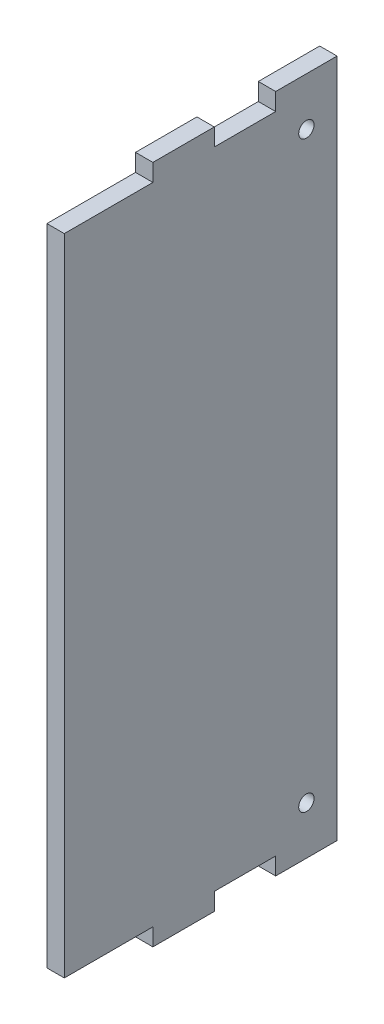
ISO-10303-21;
HEADER;
FILE_DESCRIPTION(('STEP AP214'),'2;1');
FILE_NAME('part.step','',(''),(''),'','','');
FILE_SCHEMA(('AUTOMOTIVE_DESIGN { 1 0 10303 214 1 1 1 1 }'));
ENDSEC;
DATA;
#1=APPLICATION_CONTEXT('core data for automotive mechanical design processes');
#2=APPLICATION_PROTOCOL_DEFINITION('international standard','automotive_design',2000,#1);
#3=PRODUCT_CONTEXT('',#1,'mechanical');
#4=PRODUCT('Part','Part','',(#3));
#5=PRODUCT_RELATED_PRODUCT_CATEGORY('part','',(#4));
#6=PRODUCT_DEFINITION_FORMATION('','',#4);
#7=PRODUCT_DEFINITION_CONTEXT('part definition',#1,'design');
#8=PRODUCT_DEFINITION('design','',#6,#7);
#9=PRODUCT_DEFINITION_SHAPE('','',#8);
#10=(LENGTH_UNIT() NAMED_UNIT(*) SI_UNIT(.MILLI.,.METRE.));
#11=(NAMED_UNIT(*) PLANE_ANGLE_UNIT() SI_UNIT($,.RADIAN.));
#12=(NAMED_UNIT(*) SI_UNIT($,.STERADIAN.) SOLID_ANGLE_UNIT());
#13=UNCERTAINTY_MEASURE_WITH_UNIT(LENGTH_MEASURE(1.E-05),#10,'distance_accuracy_value','');
#14=(GEOMETRIC_REPRESENTATION_CONTEXT(3) GLOBAL_UNCERTAINTY_ASSIGNED_CONTEXT((#13)) GLOBAL_UNIT_ASSIGNED_CONTEXT((#10,
#11,#12)) REPRESENTATION_CONTEXT('',''));
#15=CARTESIAN_POINT('',(0.,0.,0.));
#16=DIRECTION('',(0.,0.,1.));
#17=DIRECTION('',(1.,0.,0.));
#18=AXIS2_PLACEMENT_3D('',#15,#16,#17);
#19=CARTESIAN_POINT('',(94.0812678289956,18.4931544247679,88.8895949971045));
#20=DIRECTION('',(0.,0.,-1.));
#21=DIRECTION('',(-1.,0.,0.));
#22=AXIS2_PLACEMENT_3D('',#19,#20,#21);
#23=PLANE('',#22);
#24=DIRECTION('',(0.,-1.,0.));
#25=VECTOR('',#24,1.);
#26=CARTESIAN_POINT('',(91.2512678289956,18.4931544247679,88.8895949971045));
#27=LINE('',#26,#25);
#28=CARTESIAN_POINT('',(91.2512678289956,18.4931544247679,88.8895949971045));
#29=VERTEX_POINT('',#28);
#30=CARTESIAN_POINT('',(91.2512678289956,15.6631544247679,88.8895949971045));
#31=VERTEX_POINT('',#30);
#32=EDGE_CURVE('E178',#29,#31,#27,.T.);
#33=ORIENTED_EDGE('',*,*,#32,.T.);
#34=DIRECTION('',(-1.,0.,0.));
#35=VECTOR('',#34,1.);
#36=CARTESIAN_POINT('',(94.0812678289956,15.6631544247679,88.8895949971045));
#37=LINE('',#36,#35);
#38=CARTESIAN_POINT('',(94.0812678289956,15.6631544247679,88.8895949971045));
#39=VERTEX_POINT('',#38);
#40=EDGE_CURVE('E11',#39,#31,#37,.T.);
#41=ORIENTED_EDGE('',*,*,#40,.F.);
#42=DIRECTION('',(0.,-1.,0.));
#43=VECTOR('',#42,1.);
#44=CARTESIAN_POINT('',(94.0812678289956,18.4931544247679,88.8895949971045));
#45=LINE('',#44,#43);
#46=CARTESIAN_POINT('',(94.0812678289956,18.4931544247679,88.8895949971045));
#47=VERTEX_POINT('',#46);
#48=EDGE_CURVE('E209',#47,#39,#45,.T.);
#49=ORIENTED_EDGE('',*,*,#48,.F.);
#50=DIRECTION('',(-1.,0.,0.));
#51=VECTOR('',#50,1.);
#52=CARTESIAN_POINT('',(94.0812678289956,18.4931544247679,88.8895949971045));
#53=LINE('',#52,#51);
#54=EDGE_CURVE('E174',#47,#29,#53,.T.);
#55=ORIENTED_EDGE('',*,*,#54,.T.);
#56=EDGE_LOOP('',(#33,#41,#49,#55));
#57=FACE_BOUND('',#56,.T.);
#58=ADVANCED_FACE('F32',(#57),#23,.F.);
#59=CARTESIAN_POINT('',(94.0812678289956,15.6631544247679,88.8895949971045));
#60=DIRECTION('',(0.,1.,0.));
#61=DIRECTION('',(-1.,0.,0.));
#62=AXIS2_PLACEMENT_3D('',#59,#60,#61);
#63=PLANE('',#62);
#64=DIRECTION('',(0.,0.,-1.));
#65=VECTOR('',#64,1.);
#66=CARTESIAN_POINT('',(91.2512678289956,15.6631544247679,88.8895949971045));
#67=LINE('',#66,#65);
#68=CARTESIAN_POINT('',(91.2512678289956,15.6631544247679,78.8895949971045));
#69=VERTEX_POINT('',#68);
#70=EDGE_CURVE('E181',#31,#69,#67,.T.);
#71=ORIENTED_EDGE('',*,*,#70,.T.);
#72=DIRECTION('',(-1.,0.,0.));
#73=VECTOR('',#72,1.);
#74=CARTESIAN_POINT('',(94.0812678289956,15.6631544247679,78.8895949971045));
#75=LINE('',#74,#73);
#76=CARTESIAN_POINT('',(94.0812678289956,15.6631544247679,78.8895949971045));
#77=VERTEX_POINT('',#76);
#78=EDGE_CURVE('E41',#77,#69,#75,.T.);
#79=ORIENTED_EDGE('',*,*,#78,.F.);
#80=DIRECTION('',(0.,0.,-1.));
#81=VECTOR('',#80,1.);
#82=CARTESIAN_POINT('',(94.0812678289956,15.6631544247679,88.8895949971045));
#83=LINE('',#82,#81);
#84=EDGE_CURVE('E117',#39,#77,#83,.T.);
#85=ORIENTED_EDGE('',*,*,#84,.F.);
#86=ORIENTED_EDGE('',*,*,#40,.T.);
#87=EDGE_LOOP('',(#71,#79,#85,#86));
#88=FACE_BOUND('',#87,.T.);
#89=ADVANCED_FACE('F308',(#88),#63,.F.);
#90=CARTESIAN_POINT('',(94.0812678289956,15.6631544247679,78.8895949971045));
#91=DIRECTION('',(0.,0.,1.));
#92=DIRECTION('',(1.,0.,0.));
#93=AXIS2_PLACEMENT_3D('',#90,#91,#92);
#94=PLANE('',#93);
#95=DIRECTION('',(0.,1.,0.));
#96=VECTOR('',#95,1.);
#97=CARTESIAN_POINT('',(91.2512678289956,15.6631544247679,78.8895949971045));
#98=LINE('',#97,#96);
#99=CARTESIAN_POINT('',(91.2512678289956,18.4931544247679,78.8895949971045));
#100=VERTEX_POINT('',#99);
#101=EDGE_CURVE('E183',#69,#100,#98,.T.);
#102=ORIENTED_EDGE('',*,*,#101,.T.);
#103=DIRECTION('',(-1.,0.,0.));
#104=VECTOR('',#103,1.);
#105=CARTESIAN_POINT('',(94.0812678289956,18.4931544247679,78.8895949971045));
#106=LINE('',#105,#104);
#107=CARTESIAN_POINT('',(94.0812678289956,18.4931544247679,78.8895949971045));
#108=VERTEX_POINT('',#107);
#109=EDGE_CURVE('E240',#108,#100,#106,.T.);
#110=ORIENTED_EDGE('',*,*,#109,.F.);
#111=DIRECTION('',(0.,1.,0.));
#112=VECTOR('',#111,1.);
#113=CARTESIAN_POINT('',(94.0812678289956,15.6631544247679,78.8895949971045));
#114=LINE('',#113,#112);
#115=EDGE_CURVE('E260',#77,#108,#114,.T.);
#116=ORIENTED_EDGE('',*,*,#115,.F.);
#117=ORIENTED_EDGE('',*,*,#78,.T.);
#118=EDGE_LOOP('',(#102,#110,#116,#117));
#119=FACE_BOUND('',#118,.T.);
#120=ADVANCED_FACE('F312',(#119),#94,.F.);
#121=CARTESIAN_POINT('',(94.0812678289956,18.4931544247679,78.8895949971045));
#122=DIRECTION('',(0.,1.,0.));
#123=DIRECTION('',(-1.,0.,0.));
#124=AXIS2_PLACEMENT_3D('',#121,#122,#123);
#125=PLANE('',#124);
#126=DIRECTION('',(0.,0.,-1.));
#127=VECTOR('',#126,1.);
#128=CARTESIAN_POINT('',(91.2512678289956,18.4931544247679,78.8895949971045));
#129=LINE('',#128,#127);
#130=CARTESIAN_POINT('',(91.2512678289956,18.4931544247679,68.8895949971045));
#131=VERTEX_POINT('',#130);
#132=EDGE_CURVE('E185',#100,#131,#129,.T.);
#133=ORIENTED_EDGE('',*,*,#132,.T.);
#134=DIRECTION('',(-1.,0.,0.));
#135=VECTOR('',#134,1.);
#136=CARTESIAN_POINT('',(94.0812678289956,18.4931544247679,68.8895949971045));
#137=LINE('',#136,#135);
#138=CARTESIAN_POINT('',(94.0812678289956,18.4931544247679,68.8895949971045));
#139=VERTEX_POINT('',#138);
#140=EDGE_CURVE('E237',#139,#131,#137,.T.);
#141=ORIENTED_EDGE('',*,*,#140,.F.);
#142=DIRECTION('',(0.,0.,-1.));
#143=VECTOR('',#142,1.);
#144=CARTESIAN_POINT('',(94.0812678289956,18.4931544247679,78.8895949971045));
#145=LINE('',#144,#143);
#146=EDGE_CURVE('E262',#108,#139,#145,.T.);
#147=ORIENTED_EDGE('',*,*,#146,.F.);
#148=ORIENTED_EDGE('',*,*,#109,.T.);
#149=EDGE_LOOP('',(#133,#141,#147,#148));
#150=FACE_BOUND('',#149,.T.);
#151=ADVANCED_FACE('F316',(#150),#125,.F.);
#152=CARTESIAN_POINT('',(94.0812678289956,18.4931544247679,68.8895949971045));
#153=DIRECTION('',(0.,0.,-1.));
#154=DIRECTION('',(-1.,0.,0.));
#155=AXIS2_PLACEMENT_3D('',#152,#153,#154);
#156=PLANE('',#155);
#157=DIRECTION('',(0.,-1.,0.));
#158=VECTOR('',#157,1.);
#159=CARTESIAN_POINT('',(91.2512678289956,18.4931544247679,68.8895949971045));
#160=LINE('',#159,#158);
#161=CARTESIAN_POINT('',(91.2512678289956,15.6631544247679,68.8895949971045));
#162=VERTEX_POINT('',#161);
#163=EDGE_CURVE('E187',#131,#162,#160,.T.);
#164=ORIENTED_EDGE('',*,*,#163,.T.);
#165=DIRECTION('',(-1.,0.,0.));
#166=VECTOR('',#165,1.);
#167=CARTESIAN_POINT('',(94.0812678289956,15.6631544247679,68.8895949971045));
#168=LINE('',#167,#166);
#169=CARTESIAN_POINT('',(94.0812678289956,15.6631544247679,68.8895949971045));
#170=VERTEX_POINT('',#169);
#171=EDGE_CURVE('E234',#170,#162,#168,.T.);
#172=ORIENTED_EDGE('',*,*,#171,.F.);
#173=DIRECTION('',(0.,-1.,0.));
#174=VECTOR('',#173,1.);
#175=CARTESIAN_POINT('',(94.0812678289956,18.4931544247679,68.8895949971045));
#176=LINE('',#175,#174);
#177=EDGE_CURVE('E264',#139,#170,#176,.T.);
#178=ORIENTED_EDGE('',*,*,#177,.F.);
#179=ORIENTED_EDGE('',*,*,#140,.T.);
#180=EDGE_LOOP('',(#164,#172,#178,#179));
#181=FACE_BOUND('',#180,.T.);
#182=ADVANCED_FACE('F322',(#181),#156,.F.);
#183=CARTESIAN_POINT('',(94.0812678289956,15.6631544247679,68.8895949971045));
#184=DIRECTION('',(0.,1.,0.));
#185=DIRECTION('',(-1.,0.,0.));
#186=AXIS2_PLACEMENT_3D('',#183,#184,#185);
#187=PLANE('',#186);
#188=DIRECTION('',(0.,0.,-1.));
#189=VECTOR('',#188,1.);
#190=CARTESIAN_POINT('',(91.2512678289956,15.6631544247679,68.8895949971045));
#191=LINE('',#190,#189);
#192=CARTESIAN_POINT('',(91.2512678289956,15.6631544247679,58.8895949971045));
#193=VERTEX_POINT('',#192);
#194=EDGE_CURVE('E189',#162,#193,#191,.T.);
#195=ORIENTED_EDGE('',*,*,#194,.T.);
#196=DIRECTION('',(-1.,0.,0.));
#197=VECTOR('',#196,1.);
#198=CARTESIAN_POINT('',(94.0812678289956,15.6631544247679,58.8895949971045));
#199=LINE('',#198,#197);
#200=CARTESIAN_POINT('',(94.0812678289956,15.6631544247679,58.8895949971045));
#201=VERTEX_POINT('',#200);
#202=EDGE_CURVE('E231',#201,#193,#199,.T.);
#203=ORIENTED_EDGE('',*,*,#202,.F.);
#204=DIRECTION('',(0.,0.,-1.));
#205=VECTOR('',#204,1.);
#206=CARTESIAN_POINT('',(94.0812678289956,15.6631544247679,68.8895949971045));
#207=LINE('',#206,#205);
#208=EDGE_CURVE('E266',#170,#201,#207,.T.);
#209=ORIENTED_EDGE('',*,*,#208,.F.);
#210=ORIENTED_EDGE('',*,*,#171,.T.);
#211=EDGE_LOOP('',(#195,#203,#209,#210));
#212=FACE_BOUND('',#211,.T.);
#213=ADVANCED_FACE('F326',(#212),#187,.F.);
#214=CARTESIAN_POINT('',(94.0812678289955,123.493154424767,58.8895949971045));
#215=DIRECTION('',(0.,0.,1.));
#216=DIRECTION('',(1.,0.,0.));
#217=AXIS2_PLACEMENT_3D('',#214,#215,#216);
#218=PLANE('',#217);
#219=DIRECTION('',(0.,1.,0.));
#220=VECTOR('',#219,1.);
#221=CARTESIAN_POINT('',(91.2512678289955,123.493154424767,58.8895949971045));
#222=LINE('',#221,#220);
#223=CARTESIAN_POINT('',(91.2512678289955,126.323154424767,58.8895949971045));
#224=VERTEX_POINT('',#223);
#225=EDGE_CURVE('E192',#193,#224,#222,.T.);
#226=ORIENTED_EDGE('',*,*,#225,.T.);
#227=DIRECTION('',(-1.,0.,0.));
#228=VECTOR('',#227,1.);
#229=CARTESIAN_POINT('',(94.0812678289955,126.323154424767,58.8895949971045));
#230=LINE('',#229,#228);
#231=CARTESIAN_POINT('',(94.0812678289955,126.323154424767,58.8895949971045));
#232=VERTEX_POINT('',#231);
#233=EDGE_CURVE('E228',#232,#224,#230,.T.);
#234=ORIENTED_EDGE('',*,*,#233,.F.);
#235=DIRECTION('',(0.,1.,0.));
#236=VECTOR('',#235,1.);
#237=CARTESIAN_POINT('',(94.0812678289956,15.6631544247679,58.8895949971045));
#238=LINE('',#237,#236);
#239=EDGE_CURVE('E268',#201,#232,#238,.T.);
#240=ORIENTED_EDGE('',*,*,#239,.F.);
#241=ORIENTED_EDGE('',*,*,#202,.T.);
#242=EDGE_LOOP('',(#226,#234,#240,#241));
#243=FACE_BOUND('',#242,.T.);
#244=ADVANCED_FACE('F330',(#243),#218,.F.);
#245=CARTESIAN_POINT('',(94.0812678289955,126.323154424767,58.8895949971045));
#246=DIRECTION('',(0.,-1.,0.));
#247=DIRECTION('',(1.,0.,0.));
#248=AXIS2_PLACEMENT_3D('',#245,#246,#247);
#249=PLANE('',#248);
#250=DIRECTION('',(0.,0.,1.));
#251=VECTOR('',#250,1.);
#252=CARTESIAN_POINT('',(91.2512678289955,126.323154424767,58.8895949971045));
#253=LINE('',#252,#251);
#254=CARTESIAN_POINT('',(91.2512678289955,126.323154424767,68.8895949971045));
#255=VERTEX_POINT('',#254);
#256=EDGE_CURVE('E194',#224,#255,#253,.T.);
#257=ORIENTED_EDGE('',*,*,#256,.T.);
#258=DIRECTION('',(-1.,0.,0.));
#259=VECTOR('',#258,1.);
#260=CARTESIAN_POINT('',(94.0812678289955,126.323154424767,68.8895949971045));
#261=LINE('',#260,#259);
#262=CARTESIAN_POINT('',(94.0812678289955,126.323154424767,68.8895949971045));
#263=VERTEX_POINT('',#262);
#264=EDGE_CURVE('E225',#263,#255,#261,.T.);
#265=ORIENTED_EDGE('',*,*,#264,.F.);
#266=DIRECTION('',(0.,0.,1.));
#267=VECTOR('',#266,1.);
#268=CARTESIAN_POINT('',(94.0812678289955,126.323154424767,58.8895949971045));
#269=LINE('',#268,#267);
#270=EDGE_CURVE('E270',#232,#263,#269,.T.);
#271=ORIENTED_EDGE('',*,*,#270,.F.);
#272=ORIENTED_EDGE('',*,*,#233,.T.);
#273=EDGE_LOOP('',(#257,#265,#271,#272));
#274=FACE_BOUND('',#273,.T.);
#275=ADVANCED_FACE('F334',(#274),#249,.F.);
#276=CARTESIAN_POINT('',(94.0812678289955,126.323154424767,68.8895949971045));
#277=DIRECTION('',(0.,0.,-1.));
#278=DIRECTION('',(-1.,0.,0.));
#279=AXIS2_PLACEMENT_3D('',#276,#277,#278);
#280=PLANE('',#279);
#281=DIRECTION('',(0.,-1.,0.));
#282=VECTOR('',#281,1.);
#283=CARTESIAN_POINT('',(91.2512678289955,126.323154424767,68.8895949971045));
#284=LINE('',#283,#282);
#285=CARTESIAN_POINT('',(91.2512678289955,123.493154424767,68.8895949971045));
#286=VERTEX_POINT('',#285);
#287=EDGE_CURVE('E196',#255,#286,#284,.T.);
#288=ORIENTED_EDGE('',*,*,#287,.T.);
#289=DIRECTION('',(-1.,0.,0.));
#290=VECTOR('',#289,1.);
#291=CARTESIAN_POINT('',(94.0812678289955,123.493154424767,68.8895949971045));
#292=LINE('',#291,#290);
#293=CARTESIAN_POINT('',(94.0812678289955,123.493154424767,68.8895949971045));
#294=VERTEX_POINT('',#293);
#295=EDGE_CURVE('E222',#294,#286,#292,.T.);
#296=ORIENTED_EDGE('',*,*,#295,.F.);
#297=DIRECTION('',(0.,-1.,0.));
#298=VECTOR('',#297,1.);
#299=CARTESIAN_POINT('',(94.0812678289955,126.323154424767,68.8895949971045));
#300=LINE('',#299,#298);
#301=EDGE_CURVE('E272',#263,#294,#300,.T.);
#302=ORIENTED_EDGE('',*,*,#301,.F.);
#303=ORIENTED_EDGE('',*,*,#264,.T.);
#304=EDGE_LOOP('',(#288,#296,#302,#303));
#305=FACE_BOUND('',#304,.T.);
#306=ADVANCED_FACE('F338',(#305),#280,.F.);
#307=CARTESIAN_POINT('',(94.0812678289955,123.493154424767,78.8895949971045));
#308=DIRECTION('',(0.,-1.,0.));
#309=DIRECTION('',(1.,0.,0.));
#310=AXIS2_PLACEMENT_3D('',#307,#308,#309);
#311=PLANE('',#310);
#312=DIRECTION('',(0.,0.,1.));
#313=VECTOR('',#312,1.);
#314=CARTESIAN_POINT('',(91.2512678289955,123.493154424767,78.8895949971045));
#315=LINE('',#314,#313);
#316=CARTESIAN_POINT('',(91.2512678289955,123.493154424767,78.8895949971045));
#317=VERTEX_POINT('',#316);
#318=EDGE_CURVE('E198',#286,#317,#315,.T.);
#319=ORIENTED_EDGE('',*,*,#318,.T.);
#320=DIRECTION('',(-1.,0.,0.));
#321=VECTOR('',#320,1.);
#322=CARTESIAN_POINT('',(94.0812678289955,123.493154424767,78.8895949971045));
#323=LINE('',#322,#321);
#324=CARTESIAN_POINT('',(94.0812678289955,123.493154424767,78.8895949971045));
#325=VERTEX_POINT('',#324);
#326=EDGE_CURVE('E219',#325,#317,#323,.T.);
#327=ORIENTED_EDGE('',*,*,#326,.F.);
#328=DIRECTION('',(0.,0.,1.));
#329=VECTOR('',#328,1.);
#330=CARTESIAN_POINT('',(94.0812678289955,123.493154424767,78.8895949971045));
#331=LINE('',#330,#329);
#332=EDGE_CURVE('E274',#294,#325,#331,.T.);
#333=ORIENTED_EDGE('',*,*,#332,.F.);
#334=ORIENTED_EDGE('',*,*,#295,.T.);
#335=EDGE_LOOP('',(#319,#327,#333,#334));
#336=FACE_BOUND('',#335,.T.);
#337=ADVANCED_FACE('F342',(#336),#311,.F.);
#338=CARTESIAN_POINT('',(94.0812678289955,123.493154424767,78.8895949971045));
#339=DIRECTION('',(0.,0.,1.));
#340=DIRECTION('',(1.,0.,0.));
#341=AXIS2_PLACEMENT_3D('',#338,#339,#340);
#342=PLANE('',#341);
#343=DIRECTION('',(0.,1.,0.));
#344=VECTOR('',#343,1.);
#345=CARTESIAN_POINT('',(91.2512678289955,123.493154424767,78.8895949971045));
#346=LINE('',#345,#344);
#347=CARTESIAN_POINT('',(91.2512678289955,126.323154424767,78.8895949971045));
#348=VERTEX_POINT('',#347);
#349=EDGE_CURVE('E200',#317,#348,#346,.T.);
#350=ORIENTED_EDGE('',*,*,#349,.T.);
#351=DIRECTION('',(-1.,0.,0.));
#352=VECTOR('',#351,1.);
#353=CARTESIAN_POINT('',(94.0812678289955,126.323154424767,78.8895949971045));
#354=LINE('',#353,#352);
#355=CARTESIAN_POINT('',(94.0812678289955,126.323154424767,78.8895949971045));
#356=VERTEX_POINT('',#355);
#357=EDGE_CURVE('E216',#356,#348,#354,.T.);
#358=ORIENTED_EDGE('',*,*,#357,.F.);
#359=DIRECTION('',(0.,1.,0.));
#360=VECTOR('',#359,1.);
#361=CARTESIAN_POINT('',(94.0812678289955,123.493154424767,78.8895949971045));
#362=LINE('',#361,#360);
#363=EDGE_CURVE('E276',#325,#356,#362,.T.);
#364=ORIENTED_EDGE('',*,*,#363,.F.);
#365=ORIENTED_EDGE('',*,*,#326,.T.);
#366=EDGE_LOOP('',(#350,#358,#364,#365));
#367=FACE_BOUND('',#366,.T.);
#368=ADVANCED_FACE('F346',(#367),#342,.F.);
#369=CARTESIAN_POINT('',(94.0812678289955,126.323154424767,78.8895949971045));
#370=DIRECTION('',(0.,-1.,0.));
#371=DIRECTION('',(1.,0.,0.));
#372=AXIS2_PLACEMENT_3D('',#369,#370,#371);
#373=PLANE('',#372);
#374=DIRECTION('',(0.,0.,1.));
#375=VECTOR('',#374,1.);
#376=CARTESIAN_POINT('',(91.2512678289955,126.323154424767,78.8895949971045));
#377=LINE('',#376,#375);
#378=CARTESIAN_POINT('',(91.2512678289955,126.323154424767,88.8895949971045));
#379=VERTEX_POINT('',#378);
#380=EDGE_CURVE('E202',#348,#379,#377,.T.);
#381=ORIENTED_EDGE('',*,*,#380,.T.);
#382=DIRECTION('',(-1.,0.,0.));
#383=VECTOR('',#382,1.);
#384=CARTESIAN_POINT('',(94.0812678289955,126.323154424767,88.8895949971045));
#385=LINE('',#384,#383);
#386=CARTESIAN_POINT('',(94.0812678289955,126.323154424767,88.8895949971045));
#387=VERTEX_POINT('',#386);
#388=EDGE_CURVE('E213',#387,#379,#385,.T.);
#389=ORIENTED_EDGE('',*,*,#388,.F.);
#390=DIRECTION('',(0.,0.,1.));
#391=VECTOR('',#390,1.);
#392=CARTESIAN_POINT('',(94.0812678289955,126.323154424767,78.8895949971045));
#393=LINE('',#392,#391);
#394=EDGE_CURVE('E278',#356,#387,#393,.T.);
#395=ORIENTED_EDGE('',*,*,#394,.F.);
#396=ORIENTED_EDGE('',*,*,#357,.T.);
#397=EDGE_LOOP('',(#381,#389,#395,#396));
#398=FACE_BOUND('',#397,.T.);
#399=ADVANCED_FACE('F284',(#398),#373,.F.);
#400=CARTESIAN_POINT('',(94.0812678289955,126.323154424767,88.8895949971045));
#401=DIRECTION('',(0.,0.,-1.));
#402=DIRECTION('',(-1.,0.,0.));
#403=AXIS2_PLACEMENT_3D('',#400,#401,#402);
#404=PLANE('',#403);
#405=DIRECTION('',(0.,-1.,0.));
#406=VECTOR('',#405,1.);
#407=CARTESIAN_POINT('',(91.2512678289955,126.323154424767,88.8895949971045));
#408=LINE('',#407,#406);
#409=CARTESIAN_POINT('',(91.2512678289955,123.493154424767,88.8895949971045));
#410=VERTEX_POINT('',#409);
#411=EDGE_CURVE('E204',#379,#410,#408,.T.);
#412=ORIENTED_EDGE('',*,*,#411,.T.);
#413=DIRECTION('',(-1.,0.,0.));
#414=VECTOR('',#413,1.);
#415=CARTESIAN_POINT('',(94.0812678289955,123.493154424767,88.8895949971045));
#416=LINE('',#415,#414);
#417=CARTESIAN_POINT('',(94.0812678289955,123.493154424767,88.8895949971045));
#418=VERTEX_POINT('',#417);
#419=EDGE_CURVE('E169',#418,#410,#416,.T.);
#420=ORIENTED_EDGE('',*,*,#419,.F.);
#421=DIRECTION('',(0.,-1.,0.));
#422=VECTOR('',#421,1.);
#423=CARTESIAN_POINT('',(94.0812678289955,126.323154424767,88.8895949971045));
#424=LINE('',#423,#422);
#425=EDGE_CURVE('E160',#387,#418,#424,.T.);
#426=ORIENTED_EDGE('',*,*,#425,.F.);
#427=ORIENTED_EDGE('',*,*,#388,.T.);
#428=EDGE_LOOP('',(#412,#420,#426,#427));
#429=FACE_BOUND('',#428,.T.);
#430=ADVANCED_FACE('F288',(#429),#404,.F.);
#431=CARTESIAN_POINT('',(94.0812678289955,123.493154424767,103.31959093539));
#432=DIRECTION('',(0.,-1.,0.));
#433=DIRECTION('',(0.,0.,-1.));
#434=AXIS2_PLACEMENT_3D('',#431,#432,#433);
#435=PLANE('',#434);
#436=DIRECTION('',(0.,0.,1.));
#437=VECTOR('',#436,1.);
#438=CARTESIAN_POINT('',(91.2512678289955,123.493154424767,103.31959093539));
#439=LINE('',#438,#437);
#440=CARTESIAN_POINT('',(91.2512678289955,123.493154424767,103.31959093539));
#441=VERTEX_POINT('',#440);
#442=EDGE_CURVE('E168',#410,#441,#439,.T.);
#443=ORIENTED_EDGE('',*,*,#442,.T.);
#444=DIRECTION('',(-1.,0.,0.));
#445=VECTOR('',#444,1.);
#446=CARTESIAN_POINT('',(94.0812678289955,123.493154424767,103.31959093539));
#447=LINE('',#446,#445);
#448=CARTESIAN_POINT('',(94.0812678289955,123.493154424767,103.31959093539));
#449=VERTEX_POINT('',#448);
#450=EDGE_CURVE('E165',#449,#441,#447,.T.);
#451=ORIENTED_EDGE('',*,*,#450,.F.);
#452=DIRECTION('',(0.,0.,1.));
#453=VECTOR('',#452,1.);
#454=CARTESIAN_POINT('',(94.0812678289955,123.493154424767,103.31959093539));
#455=LINE('',#454,#453);
#456=EDGE_CURVE('E154',#418,#449,#455,.T.);
#457=ORIENTED_EDGE('',*,*,#456,.F.);
#458=ORIENTED_EDGE('',*,*,#419,.T.);
#459=EDGE_LOOP('',(#443,#451,#457,#458));
#460=FACE_BOUND('',#459,.T.);
#461=ADVANCED_FACE('F166',(#460),#435,.F.);
#462=CARTESIAN_POINT('',(94.0812678289955,18.4931544247679,103.31959093539));
#463=DIRECTION('',(0.,0.,-1.));
#464=DIRECTION('',(-1.,0.,0.));
#465=AXIS2_PLACEMENT_3D('',#462,#463,#464);
#466=PLANE('',#465);
#467=DIRECTION('',(0.,-1.,0.));
#468=VECTOR('',#467,1.);
#469=CARTESIAN_POINT('',(91.2512678289956,18.4931544247679,103.31959093539));
#470=LINE('',#469,#468);
#471=CARTESIAN_POINT('',(91.2512678289956,18.4931544247679,103.31959093539));
#472=VERTEX_POINT('',#471);
#473=EDGE_CURVE('E103',#441,#472,#470,.T.);
#474=ORIENTED_EDGE('',*,*,#473,.T.);
#475=DIRECTION('',(-1.,0.,0.));
#476=VECTOR('',#475,1.);
#477=CARTESIAN_POINT('',(94.0812678289955,18.4931544247679,103.31959093539));
#478=LINE('',#477,#476);
#479=CARTESIAN_POINT('',(94.0812678289955,18.4931544247679,103.31959093539));
#480=VERTEX_POINT('',#479);
#481=EDGE_CURVE('E170',#480,#472,#478,.T.);
#482=ORIENTED_EDGE('',*,*,#481,.F.);
#483=DIRECTION('',(0.,-1.,0.));
#484=VECTOR('',#483,1.);
#485=CARTESIAN_POINT('',(94.0812678289955,18.4931544247679,103.31959093539));
#486=LINE('',#485,#484);
#487=EDGE_CURVE('E158',#449,#480,#486,.T.);
#488=ORIENTED_EDGE('',*,*,#487,.F.);
#489=ORIENTED_EDGE('',*,*,#450,.T.);
#490=EDGE_LOOP('',(#474,#482,#488,#489));
#491=FACE_BOUND('',#490,.T.);
#492=ADVANCED_FACE('F172',(#491),#466,.F.);
#493=CARTESIAN_POINT('',(94.0812678289956,18.4931544247679,88.8895949971045));
#494=DIRECTION('',(0.,1.,0.));
#495=DIRECTION('',(-1.,0.,0.));
#496=AXIS2_PLACEMENT_3D('',#493,#494,#495);
#497=PLANE('',#496);
#498=DIRECTION('',(0.,0.,-1.));
#499=VECTOR('',#498,1.);
#500=CARTESIAN_POINT('',(91.2512678289956,18.4931544247679,88.8895949971045));
#501=LINE('',#500,#499);
#502=EDGE_CURVE('E109',#472,#29,#501,.T.);
#503=ORIENTED_EDGE('',*,*,#502,.T.);
#504=ORIENTED_EDGE('',*,*,#54,.F.);
#505=DIRECTION('',(0.,0.,-1.));
#506=VECTOR('',#505,1.);
#507=CARTESIAN_POINT('',(94.0812678289956,18.4931544247679,88.8895949971045));
#508=LINE('',#507,#506);
#509=EDGE_CURVE('E50',#480,#47,#508,.T.);
#510=ORIENTED_EDGE('',*,*,#509,.F.);
#511=ORIENTED_EDGE('',*,*,#481,.T.);
#512=EDGE_LOOP('',(#503,#504,#510,#511));
#513=FACE_BOUND('',#512,.T.);
#514=ADVANCED_FACE('F296',(#513),#497,.F.);
#515=CARTESIAN_POINT('',(94.0812678289957,0.,1.30563987162096E-13));
#516=DIRECTION('',(1.,0.,0.));
#517=DIRECTION('',(0.,0.,-1.));
#518=AXIS2_PLACEMENT_3D('',#515,#516,#517);
#519=PLANE('',#518);
#520=CARTESIAN_POINT('',(94.0812678289956,23.4931544247679,63.8895949971045));
#521=DIRECTION('',(1.,0.,0.));
#522=DIRECTION('',(0.,0.,-1.));
#523=AXIS2_PLACEMENT_3D('',#520,#521,#522);
#524=CIRCLE('',#523,1.25);
#525=CARTESIAN_POINT('',(94.0812678289956,23.4931544247679,62.6395949971045));
#526=VERTEX_POINT('',#525);
#527=EDGE_CURVE('E246',#526,#526,#524,.T.);
#528=ORIENTED_EDGE('',*,*,#527,.F.);
#529=EDGE_LOOP('',(#528));
#530=FACE_BOUND('',#529,.T.);
#531=CARTESIAN_POINT('',(94.0812678289956,118.493154424767,63.8895949971045));
#532=DIRECTION('',(1.,0.,0.));
#533=DIRECTION('',(0.,0.,-1.));
#534=AXIS2_PLACEMENT_3D('',#531,#532,#533);
#535=CIRCLE('',#534,1.25);
#536=CARTESIAN_POINT('',(94.0812678289956,118.493154424767,62.6395949971045));
#537=VERTEX_POINT('',#536);
#538=EDGE_CURVE('E251',#537,#537,#535,.T.);
#539=ORIENTED_EDGE('',*,*,#538,.F.);
#540=EDGE_LOOP('',(#539));
#541=FACE_BOUND('',#540,.T.);
#542=ORIENTED_EDGE('',*,*,#48,.T.);
#543=ORIENTED_EDGE('',*,*,#84,.T.);
#544=ORIENTED_EDGE('',*,*,#115,.T.);
#545=ORIENTED_EDGE('',*,*,#146,.T.);
#546=ORIENTED_EDGE('',*,*,#177,.T.);
#547=ORIENTED_EDGE('',*,*,#208,.T.);
#548=ORIENTED_EDGE('',*,*,#239,.T.);
#549=ORIENTED_EDGE('',*,*,#270,.T.);
#550=ORIENTED_EDGE('',*,*,#301,.T.);
#551=ORIENTED_EDGE('',*,*,#332,.T.);
#552=ORIENTED_EDGE('',*,*,#363,.T.);
#553=ORIENTED_EDGE('',*,*,#394,.T.);
#554=ORIENTED_EDGE('',*,*,#425,.T.);
#555=ORIENTED_EDGE('',*,*,#456,.T.);
#556=ORIENTED_EDGE('',*,*,#487,.T.);
#557=ORIENTED_EDGE('',*,*,#509,.T.);
#558=EDGE_LOOP('',(#542,#543,#544,#545,#546,#547,#548,#549,#550,#551,#552,#553,#554,#555,#556,#557));
#559=FACE_BOUND('',#558,.T.);
#560=ADVANCED_FACE('F156',(#530,#541,#559),#519,.T.);
#561=CARTESIAN_POINT('',(91.2512678289957,0.,1.26636573212485E-13));
#562=DIRECTION('',(1.,0.,0.));
#563=DIRECTION('',(0.,0.,-1.));
#564=AXIS2_PLACEMENT_3D('',#561,#562,#563);
#565=PLANE('',#564);
#566=CARTESIAN_POINT('',(91.2512678289956,23.4931544247679,63.8895949971045));
#567=DIRECTION('',(1.,0.,0.));
#568=DIRECTION('',(0.,0.,-1.));
#569=AXIS2_PLACEMENT_3D('',#566,#567,#568);
#570=CIRCLE('',#569,1.25);
#571=CARTESIAN_POINT('',(91.2512678289956,23.4931544247679,62.6395949971045));
#572=VERTEX_POINT('',#571);
#573=EDGE_CURVE('E35',#572,#572,#570,.T.);
#574=ORIENTED_EDGE('',*,*,#573,.T.);
#575=EDGE_LOOP('',(#574));
#576=FACE_BOUND('',#575,.T.);
#577=CARTESIAN_POINT('',(91.2512678289956,118.493154424767,63.8895949971045));
#578=DIRECTION('',(1.,0.,0.));
#579=DIRECTION('',(0.,0.,-1.));
#580=AXIS2_PLACEMENT_3D('',#577,#578,#579);
#581=CIRCLE('',#580,1.25);
#582=CARTESIAN_POINT('',(91.2512678289956,118.493154424767,62.6395949971045));
#583=VERTEX_POINT('',#582);
#584=EDGE_CURVE('E244',#583,#583,#581,.T.);
#585=ORIENTED_EDGE('',*,*,#584,.T.);
#586=EDGE_LOOP('',(#585));
#587=FACE_BOUND('',#586,.T.);
#588=ORIENTED_EDGE('',*,*,#32,.F.);
#589=ORIENTED_EDGE('',*,*,#502,.F.);
#590=ORIENTED_EDGE('',*,*,#473,.F.);
#591=ORIENTED_EDGE('',*,*,#442,.F.);
#592=ORIENTED_EDGE('',*,*,#411,.F.);
#593=ORIENTED_EDGE('',*,*,#380,.F.);
#594=ORIENTED_EDGE('',*,*,#349,.F.);
#595=ORIENTED_EDGE('',*,*,#318,.F.);
#596=ORIENTED_EDGE('',*,*,#287,.F.);
#597=ORIENTED_EDGE('',*,*,#256,.F.);
#598=ORIENTED_EDGE('',*,*,#225,.F.);
#599=ORIENTED_EDGE('',*,*,#194,.F.);
#600=ORIENTED_EDGE('',*,*,#163,.F.);
#601=ORIENTED_EDGE('',*,*,#132,.F.);
#602=ORIENTED_EDGE('',*,*,#101,.F.);
#603=ORIENTED_EDGE('',*,*,#70,.F.);
#604=EDGE_LOOP('',(#588,#589,#590,#591,#592,#593,#594,#595,#596,#597,#598,#599,#600,#601,#602,#603));
#605=FACE_BOUND('',#604,.T.);
#606=ADVANCED_FACE('F291',(#576,#587,#605),#565,.F.);
#607=CARTESIAN_POINT('',(67.7157339230646,118.493154424767,63.8895949971044));
#608=DIRECTION('',(1.,0.,0.));
#609=DIRECTION('',(0.,0.,-1.));
#610=AXIS2_PLACEMENT_3D('',#607,#608,#609);
#611=CYLINDRICAL_SURFACE('',#610,1.25);
#612=CARTESIAN_POINT('',(94.0812678289956,118.493154424767,62.6395949971045));
#613=CARTESIAN_POINT('',(94.0517886623289,118.493154424767,62.6395949971045));
#614=CARTESIAN_POINT('',(94.0223094956623,118.493154424767,62.6395949971045));
#615=CARTESIAN_POINT('',(93.9633511623289,118.493154424767,62.6395949971045));
#616=CARTESIAN_POINT('',(93.9338719956623,118.493154424767,62.6395949971045));
#617=CARTESIAN_POINT('',(93.874913662329,118.493154424767,62.6395949971045));
#618=CARTESIAN_POINT('',(93.8454344956623,118.493154424767,62.6395949971045));
#619=CARTESIAN_POINT('',(93.786476162329,118.493154424767,62.6395949971045));
#620=CARTESIAN_POINT('',(93.7569969956623,118.493154424767,62.6395949971045));
#621=CARTESIAN_POINT('',(93.6980386623289,118.493154424767,62.6395949971045));
#622=CARTESIAN_POINT('',(93.6685594956623,118.493154424767,62.6395949971045));
#623=CARTESIAN_POINT('',(93.6096011623289,118.493154424767,62.6395949971045));
#624=CARTESIAN_POINT('',(93.5801219956623,118.493154424767,62.6395949971045));
#625=CARTESIAN_POINT('',(93.5211636623289,118.493154424767,62.6395949971045));
#626=CARTESIAN_POINT('',(93.4916844956623,118.493154424767,62.6395949971045));
#627=CARTESIAN_POINT('',(93.4327261623289,118.493154424767,62.6395949971045));
#628=CARTESIAN_POINT('',(93.4032469956623,118.493154424767,62.6395949971045));
#629=CARTESIAN_POINT('',(93.3442886623289,118.493154424767,62.6395949971045));
#630=CARTESIAN_POINT('',(93.3148094956623,118.493154424767,62.6395949971045));
#631=CARTESIAN_POINT('',(93.2558511623289,118.493154424767,62.6395949971045));
#632=CARTESIAN_POINT('',(93.2263719956623,118.493154424767,62.6395949971045));
#633=CARTESIAN_POINT('',(93.1674136623289,118.493154424767,62.6395949971045));
#634=CARTESIAN_POINT('',(93.1379344956623,118.493154424767,62.6395949971045));
#635=CARTESIAN_POINT('',(93.0789761623289,118.493154424767,62.6395949971045));
#636=CARTESIAN_POINT('',(93.0494969956623,118.493154424767,62.6395949971045));
#637=CARTESIAN_POINT('',(92.9905386623289,118.493154424767,62.6395949971045));
#638=CARTESIAN_POINT('',(92.9610594956623,118.493154424767,62.6395949971045));
#639=CARTESIAN_POINT('',(92.9021011623289,118.493154424767,62.6395949971045));
#640=CARTESIAN_POINT('',(92.8726219956623,118.493154424767,62.6395949971045));
#641=CARTESIAN_POINT('',(92.8136636623289,118.493154424767,62.6395949971045));
#642=CARTESIAN_POINT('',(92.7841844956623,118.493154424767,62.6395949971045));
#643=CARTESIAN_POINT('',(92.7252261623289,118.493154424767,62.6395949971045));
#644=CARTESIAN_POINT('',(92.6957469956623,118.493154424767,62.6395949971045));
#645=CARTESIAN_POINT('',(92.6367886623289,118.493154424767,62.6395949971045));
#646=CARTESIAN_POINT('',(92.6073094956623,118.493154424767,62.6395949971045));
#647=CARTESIAN_POINT('',(92.5483511623289,118.493154424767,62.6395949971045));
#648=CARTESIAN_POINT('',(92.5188719956623,118.493154424767,62.6395949971045));
#649=CARTESIAN_POINT('',(92.4599136623289,118.493154424767,62.6395949971045));
#650=CARTESIAN_POINT('',(92.4304344956623,118.493154424767,62.6395949971045));
#651=CARTESIAN_POINT('',(92.3714761623289,118.493154424767,62.6395949971045));
#652=CARTESIAN_POINT('',(92.3419969956623,118.493154424767,62.6395949971045));
#653=CARTESIAN_POINT('',(92.2830386623289,118.493154424767,62.6395949971045));
#654=CARTESIAN_POINT('',(92.2535594956623,118.493154424767,62.6395949971045));
#655=CARTESIAN_POINT('',(92.1946011623289,118.493154424767,62.6395949971045));
#656=CARTESIAN_POINT('',(92.1651219956623,118.493154424767,62.6395949971045));
#657=CARTESIAN_POINT('',(92.106163662329,118.493154424767,62.6395949971045));
#658=CARTESIAN_POINT('',(92.0766844956623,118.493154424767,62.6395949971045));
#659=CARTESIAN_POINT('',(92.0177261623289,118.493154424767,62.6395949971045));
#660=CARTESIAN_POINT('',(91.9882469956623,118.493154424767,62.6395949971045));
#661=CARTESIAN_POINT('',(91.9292886623289,118.493154424767,62.6395949971045));
#662=CARTESIAN_POINT('',(91.8998094956623,118.493154424767,62.6395949971045));
#663=CARTESIAN_POINT('',(91.8408511623289,118.493154424767,62.6395949971045));
#664=CARTESIAN_POINT('',(91.8113719956623,118.493154424767,62.6395949971045));
#665=CARTESIAN_POINT('',(91.7524136623289,118.493154424767,62.6395949971045));
#666=CARTESIAN_POINT('',(91.7229344956623,118.493154424767,62.6395949971045));
#667=CARTESIAN_POINT('',(91.6639761623289,118.493154424767,62.6395949971045));
#668=CARTESIAN_POINT('',(91.6344969956623,118.493154424767,62.6395949971045));
#669=CARTESIAN_POINT('',(91.5755386623289,118.493154424767,62.6395949971045));
#670=CARTESIAN_POINT('',(91.5460594956623,118.493154424767,62.6395949971045));
#671=CARTESIAN_POINT('',(91.4871011623289,118.493154424767,62.6395949971045));
#672=CARTESIAN_POINT('',(91.4576219956623,118.493154424767,62.6395949971045));
#673=CARTESIAN_POINT('',(91.3986636623289,118.493154424767,62.6395949971045));
#674=CARTESIAN_POINT('',(91.3691844956623,118.493154424767,62.6395949971045));
#675=CARTESIAN_POINT('',(91.3102261623289,118.493154424767,62.6395949971045));
#676=CARTESIAN_POINT('',(91.2807469956623,118.493154424767,62.6395949971045));
#677=CARTESIAN_POINT('',(91.2512678289956,118.493154424767,62.6395949971045));
#678=B_SPLINE_CURVE_WITH_KNOTS('',3,(#612,#613,#614,#615,#616,#617,#618,#619,#620,#621,#622,
#623,#624,#625,#626,#627,#628,#629,#630,#631,#632,#633,#634,#635,#636,#637,#638,#639,#640,#641,
#642,#643,#644,#645,#646,#647,#648,#649,#650,#651,#652,#653,#654,#655,#656,#657,#658,#659,#660,
#661,#662,#663,#664,#665,#666,#667,#668,#669,#670,#671,#672,#673,#674,#675,#676,#677),
.UNSPECIFIED.,.F.,.F.,(4,2,2,2,2,2,2,2,2,2,2,2,2,2,2,2,2,2,2,2,2,2,2,2,2,2,2,2,2,2,2,2,4),(0.,
0.0884374999999965,0.176874999999993,0.26531249999999,0.35375,0.442187499999996,
0.530624999999993,0.619062500000003,0.7075,0.795937499999996,0.884375000000007,
0.972812500000003,1.06125,1.1496875,1.23812499999999,1.3265625,1.415,1.5034375,1.59187500000001,
1.6803125,1.76875,1.8571875,1.94562499999999,2.0340625,2.1225,2.2109375,2.29937500000001,
2.3878125,2.47625,2.56468750000001,2.65312500000001,2.7415625,2.83),.UNSPECIFIED.);
#679=EDGE_CURVE('BSEAM386',#537,#583,#678,.T.);
#680=ORIENTED_EDGE('',*,*,#538,.T.);
#681=ORIENTED_EDGE('',*,*,#584,.F.);
#682=ORIENTED_EDGE('',*,*,#679,.T.);
#683=ORIENTED_EDGE('',*,*,#679,.F.);
#684=EDGE_LOOP('',(#680,#682,#681,#683));
#685=FACE_BOUND('',#684,.T.);
#686=ADVANCED_FACE('F386',(#685),#611,.F.);
#687=CARTESIAN_POINT('',(67.7157339230646,23.4931544247679,63.8895949971044));
#688=DIRECTION('',(1.,0.,0.));
#689=DIRECTION('',(0.,0.,-1.));
#690=AXIS2_PLACEMENT_3D('',#687,#688,#689);
#691=CYLINDRICAL_SURFACE('',#690,1.25);
#692=CARTESIAN_POINT('',(94.0812678289956,23.4931544247679,62.6395949971045));
#693=CARTESIAN_POINT('',(94.0517886623289,23.4931544247679,62.6395949971045));
#694=CARTESIAN_POINT('',(94.0223094956623,23.4931544247679,62.6395949971045));
#695=CARTESIAN_POINT('',(93.9633511623289,23.4931544247679,62.6395949971045));
#696=CARTESIAN_POINT('',(93.9338719956623,23.4931544247679,62.6395949971045));
#697=CARTESIAN_POINT('',(93.874913662329,23.4931544247679,62.6395949971045));
#698=CARTESIAN_POINT('',(93.8454344956623,23.4931544247679,62.6395949971045));
#699=CARTESIAN_POINT('',(93.786476162329,23.4931544247679,62.6395949971045));
#700=CARTESIAN_POINT('',(93.7569969956623,23.4931544247679,62.6395949971045));
#701=CARTESIAN_POINT('',(93.6980386623289,23.4931544247679,62.6395949971045));
#702=CARTESIAN_POINT('',(93.6685594956623,23.4931544247679,62.6395949971045));
#703=CARTESIAN_POINT('',(93.6096011623289,23.4931544247679,62.6395949971045));
#704=CARTESIAN_POINT('',(93.5801219956623,23.4931544247679,62.6395949971045));
#705=CARTESIAN_POINT('',(93.5211636623289,23.4931544247679,62.6395949971045));
#706=CARTESIAN_POINT('',(93.4916844956623,23.4931544247679,62.6395949971045));
#707=CARTESIAN_POINT('',(93.4327261623289,23.4931544247679,62.6395949971045));
#708=CARTESIAN_POINT('',(93.4032469956623,23.4931544247679,62.6395949971045));
#709=CARTESIAN_POINT('',(93.3442886623289,23.4931544247679,62.6395949971045));
#710=CARTESIAN_POINT('',(93.3148094956623,23.4931544247679,62.6395949971045));
#711=CARTESIAN_POINT('',(93.2558511623289,23.4931544247679,62.6395949971045));
#712=CARTESIAN_POINT('',(93.2263719956623,23.4931544247679,62.6395949971045));
#713=CARTESIAN_POINT('',(93.1674136623289,23.4931544247679,62.6395949971045));
#714=CARTESIAN_POINT('',(93.1379344956623,23.4931544247679,62.6395949971045));
#715=CARTESIAN_POINT('',(93.0789761623289,23.4931544247679,62.6395949971045));
#716=CARTESIAN_POINT('',(93.0494969956623,23.4931544247679,62.6395949971045));
#717=CARTESIAN_POINT('',(92.9905386623289,23.4931544247679,62.6395949971045));
#718=CARTESIAN_POINT('',(92.9610594956623,23.4931544247679,62.6395949971045));
#719=CARTESIAN_POINT('',(92.9021011623289,23.4931544247679,62.6395949971045));
#720=CARTESIAN_POINT('',(92.8726219956623,23.4931544247679,62.6395949971045));
#721=CARTESIAN_POINT('',(92.8136636623289,23.4931544247679,62.6395949971045));
#722=CARTESIAN_POINT('',(92.7841844956623,23.4931544247679,62.6395949971045));
#723=CARTESIAN_POINT('',(92.7252261623289,23.4931544247679,62.6395949971045));
#724=CARTESIAN_POINT('',(92.6957469956623,23.4931544247679,62.6395949971045));
#725=CARTESIAN_POINT('',(92.6367886623289,23.4931544247679,62.6395949971045));
#726=CARTESIAN_POINT('',(92.6073094956623,23.4931544247679,62.6395949971045));
#727=CARTESIAN_POINT('',(92.5483511623289,23.4931544247679,62.6395949971045));
#728=CARTESIAN_POINT('',(92.5188719956623,23.4931544247679,62.6395949971045));
#729=CARTESIAN_POINT('',(92.4599136623289,23.4931544247679,62.6395949971045));
#730=CARTESIAN_POINT('',(92.4304344956623,23.4931544247679,62.6395949971045));
#731=CARTESIAN_POINT('',(92.3714761623289,23.4931544247679,62.6395949971045));
#732=CARTESIAN_POINT('',(92.3419969956623,23.4931544247679,62.6395949971045));
#733=CARTESIAN_POINT('',(92.2830386623289,23.4931544247679,62.6395949971045));
#734=CARTESIAN_POINT('',(92.2535594956623,23.4931544247679,62.6395949971045));
#735=CARTESIAN_POINT('',(92.1946011623289,23.4931544247679,62.6395949971045));
#736=CARTESIAN_POINT('',(92.1651219956623,23.4931544247679,62.6395949971045));
#737=CARTESIAN_POINT('',(92.106163662329,23.4931544247679,62.6395949971045));
#738=CARTESIAN_POINT('',(92.0766844956623,23.4931544247679,62.6395949971045));
#739=CARTESIAN_POINT('',(92.0177261623289,23.4931544247679,62.6395949971045));
#740=CARTESIAN_POINT('',(91.9882469956623,23.4931544247679,62.6395949971045));
#741=CARTESIAN_POINT('',(91.9292886623289,23.4931544247679,62.6395949971045));
#742=CARTESIAN_POINT('',(91.8998094956623,23.4931544247679,62.6395949971045));
#743=CARTESIAN_POINT('',(91.8408511623289,23.4931544247679,62.6395949971045));
#744=CARTESIAN_POINT('',(91.8113719956623,23.4931544247679,62.6395949971045));
#745=CARTESIAN_POINT('',(91.7524136623289,23.4931544247679,62.6395949971045));
#746=CARTESIAN_POINT('',(91.7229344956623,23.4931544247679,62.6395949971045));
#747=CARTESIAN_POINT('',(91.6639761623289,23.4931544247679,62.6395949971045));
#748=CARTESIAN_POINT('',(91.6344969956623,23.4931544247679,62.6395949971045));
#749=CARTESIAN_POINT('',(91.5755386623289,23.4931544247679,62.6395949971045));
#750=CARTESIAN_POINT('',(91.5460594956623,23.4931544247679,62.6395949971045));
#751=CARTESIAN_POINT('',(91.4871011623289,23.4931544247679,62.6395949971045));
#752=CARTESIAN_POINT('',(91.4576219956623,23.4931544247679,62.6395949971045));
#753=CARTESIAN_POINT('',(91.3986636623289,23.4931544247679,62.6395949971045));
#754=CARTESIAN_POINT('',(91.3691844956623,23.4931544247679,62.6395949971045));
#755=CARTESIAN_POINT('',(91.3102261623289,23.4931544247679,62.6395949971045));
#756=CARTESIAN_POINT('',(91.2807469956623,23.4931544247679,62.6395949971045));
#757=CARTESIAN_POINT('',(91.2512678289956,23.4931544247679,62.6395949971045));
#758=B_SPLINE_CURVE_WITH_KNOTS('',3,(#692,#693,#694,#695,#696,#697,#698,#699,#700,#701,#702,
#703,#704,#705,#706,#707,#708,#709,#710,#711,#712,#713,#714,#715,#716,#717,#718,#719,#720,#721,
#722,#723,#724,#725,#726,#727,#728,#729,#730,#731,#732,#733,#734,#735,#736,#737,#738,#739,#740,
#741,#742,#743,#744,#745,#746,#747,#748,#749,#750,#751,#752,#753,#754,#755,#756,#757),
.UNSPECIFIED.,.F.,.F.,(4,2,2,2,2,2,2,2,2,2,2,2,2,2,2,2,2,2,2,2,2,2,2,2,2,2,2,2,2,2,2,2,4),(0.,
0.0884374999999965,0.176874999999993,0.26531249999999,0.35375,0.442187499999996,
0.530624999999993,0.619062500000003,0.7075,0.795937499999996,0.884375000000007,
0.972812500000003,1.06125,1.1496875,1.23812499999999,1.3265625,1.415,1.5034375,1.59187500000001,
1.6803125,1.76875,1.8571875,1.94562499999999,2.0340625,2.1225,2.2109375,2.29937500000001,
2.3878125,2.47625,2.56468750000001,2.65312500000001,2.7415625,2.83),.UNSPECIFIED.);
#759=EDGE_CURVE('BSEAM395',#526,#572,#758,.T.);
#760=ORIENTED_EDGE('',*,*,#527,.T.);
#761=ORIENTED_EDGE('',*,*,#573,.F.);
#762=ORIENTED_EDGE('',*,*,#759,.T.);
#763=ORIENTED_EDGE('',*,*,#759,.F.);
#764=EDGE_LOOP('',(#760,#762,#761,#763));
#765=FACE_BOUND('',#764,.T.);
#766=ADVANCED_FACE('F395',(#765),#691,.F.);
#767=CLOSED_SHELL('',(#58,#89,#120,#151,#182,#213,#244,#275,#306,#337,#368,#399,#430,#461,#492,
#514,#560,#606,#686,#766));
#768=MANIFOLD_SOLID_BREP('B2',#767);
#769=ADVANCED_BREP_SHAPE_REPRESENTATION('',(#18,#768),#14);
#770=SHAPE_DEFINITION_REPRESENTATION(#9,#769);
ENDSEC;
END-ISO-10303-21;
